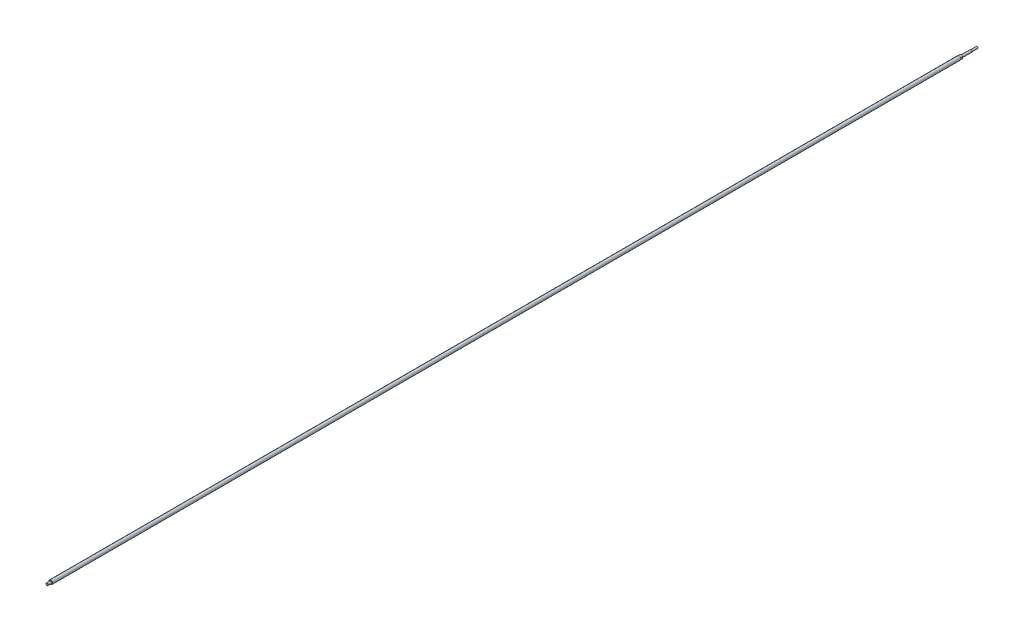
ISO-10303-21;
HEADER;
FILE_DESCRIPTION(('STEP AP214'),'2;1');
FILE_NAME('part.step','',(''),(''),'','','');
FILE_SCHEMA(('AUTOMOTIVE_DESIGN { 1 0 10303 214 1 1 1 1 }'));
ENDSEC;
DATA;
#1=APPLICATION_CONTEXT('core data for automotive mechanical design processes');
#2=APPLICATION_PROTOCOL_DEFINITION('international standard','automotive_design',2000,#1);
#3=PRODUCT_CONTEXT('',#1,'mechanical');
#4=PRODUCT('Part','Part','',(#3));
#5=PRODUCT_RELATED_PRODUCT_CATEGORY('part','',(#4));
#6=PRODUCT_DEFINITION_FORMATION('','',#4);
#7=PRODUCT_DEFINITION_CONTEXT('part definition',#1,'design');
#8=PRODUCT_DEFINITION('design','',#6,#7);
#9=PRODUCT_DEFINITION_SHAPE('','',#8);
#10=(LENGTH_UNIT() NAMED_UNIT(*) SI_UNIT(.MILLI.,.METRE.));
#11=(NAMED_UNIT(*) PLANE_ANGLE_UNIT() SI_UNIT($,.RADIAN.));
#12=(NAMED_UNIT(*) SI_UNIT($,.STERADIAN.) SOLID_ANGLE_UNIT());
#13=UNCERTAINTY_MEASURE_WITH_UNIT(LENGTH_MEASURE(1.E-05),#10,'distance_accuracy_value','');
#14=(GEOMETRIC_REPRESENTATION_CONTEXT(3) GLOBAL_UNCERTAINTY_ASSIGNED_CONTEXT((#13)) GLOBAL_UNIT_ASSIGNED_CONTEXT((#10,
#11,#12)) REPRESENTATION_CONTEXT('',''));
#15=CARTESIAN_POINT('',(0.,0.,0.));
#16=DIRECTION('',(0.,0.,1.));
#17=DIRECTION('',(1.,0.,0.));
#18=AXIS2_PLACEMENT_3D('',#15,#16,#17);
#19=CARTESIAN_POINT('',(0.,0.,2500.));
#20=DIRECTION('',(0.,0.,-1.));
#21=DIRECTION('',(-1.,0.,0.));
#22=AXIS2_PLACEMENT_3D('',#19,#20,#21);
#23=CYLINDRICAL_SURFACE('',#22,5.);
#24=CARTESIAN_POINT('',(0.,0.,49.5));
#25=DIRECTION('',(0.,0.,-1.));
#26=DIRECTION('',(-1.,0.,0.));
#27=AXIS2_PLACEMENT_3D('',#24,#25,#26);
#28=CIRCLE('',#27,5.);
#29=CARTESIAN_POINT('',(-5.,0.,49.5));
#30=VERTEX_POINT('',#29);
#31=EDGE_CURVE('E11',#30,#30,#28,.T.);
#32=ORIENTED_EDGE('',*,*,#31,.F.);
#33=EDGE_LOOP('',(#32));
#34=FACE_BOUND('',#33,.T.);
#35=CARTESIAN_POINT('',(0.,0.,2490.));
#36=DIRECTION('',(0.,0.,1.));
#37=DIRECTION('',(1.,0.,0.));
#38=AXIS2_PLACEMENT_3D('',#35,#36,#37);
#39=CIRCLE('',#38,5.);
#40=CARTESIAN_POINT('',(5.,0.,2490.));
#41=VERTEX_POINT('',#40);
#42=EDGE_CURVE('E134',#41,#41,#39,.T.);
#43=ORIENTED_EDGE('',*,*,#42,.F.);
#44=EDGE_LOOP('',(#43));
#45=FACE_BOUND('',#44,.T.);
#46=ADVANCED_FACE('F39',(#34,#45),#23,.T.);
#47=CARTESIAN_POINT('',(0.,0.,43.));
#48=DIRECTION('',(0.,0.,-1.));
#49=DIRECTION('',(-1.,0.,0.));
#50=AXIS2_PLACEMENT_3D('',#47,#48,#49);
#51=CYLINDRICAL_SURFACE('',#50,3.);
#52=CARTESIAN_POINT('',(0.,0.,43.));
#53=DIRECTION('',(0.,0.,-1.));
#54=DIRECTION('',(-1.,0.,0.));
#55=AXIS2_PLACEMENT_3D('',#52,#53,#54);
#56=CIRCLE('',#55,3.);
#57=CARTESIAN_POINT('',(-3.,0.,43.));
#58=VERTEX_POINT('',#57);
#59=EDGE_CURVE('E108',#58,#58,#56,.T.);
#60=ORIENTED_EDGE('',*,*,#59,.T.);
#61=EDGE_LOOP('',(#60));
#62=FACE_BOUND('',#61,.T.);
#63=CARTESIAN_POINT('',(0.,0.,16.));
#64=DIRECTION('',(0.,0.,-1.));
#65=DIRECTION('',(-1.,0.,0.));
#66=AXIS2_PLACEMENT_3D('',#63,#64,#65);
#67=CIRCLE('',#66,3.);
#68=CARTESIAN_POINT('',(-3.,0.,16.));
#69=VERTEX_POINT('',#68);
#70=EDGE_CURVE('E124',#69,#69,#67,.T.);
#71=ORIENTED_EDGE('',*,*,#70,.F.);
#72=EDGE_LOOP('',(#71));
#73=FACE_BOUND('',#72,.T.);
#74=ADVANCED_FACE('F164',(#62,#73),#51,.T.);
#75=CARTESIAN_POINT('',(0.,0.,49.5));
#76=DIRECTION('',(0.,0.,-1.));
#77=DIRECTION('',(-1.,0.,0.));
#78=AXIS2_PLACEMENT_3D('',#75,#76,#77);
#79=CYLINDRICAL_SURFACE('',#78,4.75);
#80=DIRECTION('',(0.,0.,-1.));
#81=VECTOR('',#80,1.);
#82=CARTESIAN_POINT('',(4.,2.5617376914899,54.678078794302));
#83=LINE('',#82,#81);
#84=CARTESIAN_POINT('',(4.,2.5617376914899,49.5));
#85=VERTEX_POINT('',#84);
#86=CARTESIAN_POINT('',(4.,2.5617376914899,43.));
#87=VERTEX_POINT('',#86);
#88=EDGE_CURVE('E80',#85,#87,#83,.T.);
#89=ORIENTED_EDGE('',*,*,#88,.T.);
#90=CARTESIAN_POINT('',(0.,0.,43.));
#91=DIRECTION('',(0.,0.,-1.));
#92=DIRECTION('',(-1.,0.,0.));
#93=AXIS2_PLACEMENT_3D('',#90,#91,#92);
#94=CIRCLE('',#93,4.75);
#95=CARTESIAN_POINT('',(-4.,2.5617376914899,43.));
#96=VERTEX_POINT('',#95);
#97=EDGE_CURVE('E93',#96,#87,#94,.T.);
#98=ORIENTED_EDGE('',*,*,#97,.F.);
#99=DIRECTION('',(0.,0.,-1.));
#100=VECTOR('',#99,1.);
#101=CARTESIAN_POINT('',(-4.,2.5617376914899,54.678078794302));
#102=LINE('',#101,#100);
#103=CARTESIAN_POINT('',(-4.,2.5617376914899,49.5));
#104=VERTEX_POINT('',#103);
#105=EDGE_CURVE('E62',#104,#96,#102,.T.);
#106=ORIENTED_EDGE('',*,*,#105,.F.);
#107=CARTESIAN_POINT('',(0.,0.,49.5));
#108=DIRECTION('',(0.,0.,-1.));
#109=DIRECTION('',(-1.,0.,0.));
#110=AXIS2_PLACEMENT_3D('',#107,#108,#109);
#111=CIRCLE('',#110,4.75);
#112=EDGE_CURVE('E47',#104,#85,#111,.T.);
#113=ORIENTED_EDGE('',*,*,#112,.T.);
#114=EDGE_LOOP('',(#89,#98,#106,#113));
#115=FACE_BOUND('',#114,.T.);
#116=ADVANCED_FACE('F92',(#115),#79,.T.);
#117=DIRECTION('',(0.,0.,-1.));
#118=VECTOR('',#117,1.);
#119=CARTESIAN_POINT('',(4.,-2.5617376914899,54.678078794302));
#120=LINE('',#119,#118);
#121=CARTESIAN_POINT('',(4.,-2.5617376914899,49.5));
#122=VERTEX_POINT('',#121);
#123=CARTESIAN_POINT('',(4.,-2.5617376914899,43.));
#124=VERTEX_POINT('',#123);
#125=EDGE_CURVE('E54',#122,#124,#120,.T.);
#126=ORIENTED_EDGE('',*,*,#125,.F.);
#127=CARTESIAN_POINT('',(-4.,-2.5617376914899,49.5));
#128=VERTEX_POINT('',#127);
#129=EDGE_CURVE('E102',#122,#128,#111,.T.);
#130=ORIENTED_EDGE('',*,*,#129,.T.);
#131=DIRECTION('',(0.,0.,-1.));
#132=VECTOR('',#131,1.);
#133=CARTESIAN_POINT('',(-4.,-2.5617376914899,54.678078794302));
#134=LINE('',#133,#132);
#135=CARTESIAN_POINT('',(-4.,-2.5617376914899,43.));
#136=VERTEX_POINT('',#135);
#137=EDGE_CURVE('E116',#128,#136,#134,.T.);
#138=ORIENTED_EDGE('',*,*,#137,.T.);
#139=EDGE_CURVE('E103',#124,#136,#94,.T.);
#140=ORIENTED_EDGE('',*,*,#139,.F.);
#141=EDGE_LOOP('',(#126,#130,#138,#140));
#142=FACE_BOUND('',#141,.T.);
#143=ADVANCED_FACE('F175',(#142),#79,.T.);
#144=CARTESIAN_POINT('',(0.,0.,49.5));
#145=DIRECTION('',(0.,0.,-1.));
#146=DIRECTION('',(-1.,0.,0.));
#147=AXIS2_PLACEMENT_3D('',#144,#145,#146);
#148=PLANE('',#147);
#149=ORIENTED_EDGE('',*,*,#112,.F.);
#150=DIRECTION('',(0.,1.,0.));
#151=VECTOR('',#150,1.);
#152=CARTESIAN_POINT('',(-4.,2.5617376914899,49.5));
#153=LINE('',#152,#151);
#154=EDGE_CURVE('E87',#128,#104,#153,.T.);
#155=ORIENTED_EDGE('',*,*,#154,.F.);
#156=ORIENTED_EDGE('',*,*,#129,.F.);
#157=DIRECTION('',(0.,-1.,0.));
#158=VECTOR('',#157,1.);
#159=CARTESIAN_POINT('',(4.,2.5617376914899,49.5));
#160=LINE('',#159,#158);
#161=EDGE_CURVE('E96',#85,#122,#160,.T.);
#162=ORIENTED_EDGE('',*,*,#161,.F.);
#163=EDGE_LOOP('',(#149,#155,#156,#162));
#164=FACE_BOUND('',#163,.T.);
#165=ORIENTED_EDGE('',*,*,#31,.T.);
#166=EDGE_LOOP('',(#165));
#167=FACE_BOUND('',#166,.T.);
#168=ADVANCED_FACE('F173',(#164,#167),#148,.T.);
#169=CARTESIAN_POINT('',(0.,0.,43.));
#170=DIRECTION('',(0.,0.,-1.));
#171=DIRECTION('',(-1.,0.,0.));
#172=AXIS2_PLACEMENT_3D('',#169,#170,#171);
#173=PLANE('',#172);
#174=DIRECTION('',(0.,1.,0.));
#175=VECTOR('',#174,1.);
#176=CARTESIAN_POINT('',(4.,2.5617376914899,43.));
#177=LINE('',#176,#175);
#178=EDGE_CURVE('E77',#124,#87,#177,.T.);
#179=ORIENTED_EDGE('',*,*,#178,.F.);
#180=ORIENTED_EDGE('',*,*,#139,.T.);
#181=DIRECTION('',(0.,-1.,0.));
#182=VECTOR('',#181,1.);
#183=CARTESIAN_POINT('',(-4.,2.5617376914899,43.));
#184=LINE('',#183,#182);
#185=EDGE_CURVE('E100',#96,#136,#184,.T.);
#186=ORIENTED_EDGE('',*,*,#185,.F.);
#187=ORIENTED_EDGE('',*,*,#97,.T.);
#188=EDGE_LOOP('',(#179,#180,#186,#187));
#189=FACE_BOUND('',#188,.T.);
#190=ORIENTED_EDGE('',*,*,#59,.F.);
#191=EDGE_LOOP('',(#190));
#192=FACE_BOUND('',#191,.T.);
#193=ADVANCED_FACE('F98',(#189,#192),#173,.T.);
#194=CARTESIAN_POINT('',(-4.,2.5617376914899,54.678078794302));
#195=DIRECTION('',(1.,0.,0.));
#196=DIRECTION('',(0.,0.,-1.));
#197=AXIS2_PLACEMENT_3D('',#194,#195,#196);
#198=PLANE('',#197);
#199=ORIENTED_EDGE('',*,*,#154,.T.);
#200=ORIENTED_EDGE('',*,*,#105,.T.);
#201=ORIENTED_EDGE('',*,*,#185,.T.);
#202=ORIENTED_EDGE('',*,*,#137,.F.);
#203=EDGE_LOOP('',(#199,#200,#201,#202));
#204=FACE_BOUND('',#203,.T.);
#205=ADVANCED_FACE('F182',(#204),#198,.F.);
#206=CARTESIAN_POINT('',(4.,2.5617376914899,54.678078794302));
#207=DIRECTION('',(-1.,0.,0.));
#208=DIRECTION('',(0.,0.,1.));
#209=AXIS2_PLACEMENT_3D('',#206,#207,#208);
#210=PLANE('',#209);
#211=ORIENTED_EDGE('',*,*,#161,.T.);
#212=ORIENTED_EDGE('',*,*,#125,.T.);
#213=ORIENTED_EDGE('',*,*,#178,.T.);
#214=ORIENTED_EDGE('',*,*,#88,.F.);
#215=EDGE_LOOP('',(#211,#212,#213,#214));
#216=FACE_BOUND('',#215,.T.);
#217=ADVANCED_FACE('F79',(#216),#210,.F.);
#218=CARTESIAN_POINT('',(0.,0.,16.));
#219=DIRECTION('',(0.,0.,-1.));
#220=DIRECTION('',(-1.,0.,0.));
#221=AXIS2_PLACEMENT_3D('',#218,#219,#220);
#222=CYLINDRICAL_SURFACE('',#221,2.5);
#223=CARTESIAN_POINT('',(0.,0.,16.));
#224=DIRECTION('',(0.,0.,-1.));
#225=DIRECTION('',(-1.,0.,0.));
#226=AXIS2_PLACEMENT_3D('',#223,#224,#225);
#227=CIRCLE('',#226,2.5);
#228=CARTESIAN_POINT('',(-2.5,0.,16.));
#229=VERTEX_POINT('',#228);
#230=EDGE_CURVE('E133',#229,#229,#227,.T.);
#231=ORIENTED_EDGE('',*,*,#230,.T.);
#232=EDGE_LOOP('',(#231));
#233=FACE_BOUND('',#232,.T.);
#234=CARTESIAN_POINT('',(0.,0.,0.));
#235=DIRECTION('',(0.,0.,-1.));
#236=DIRECTION('',(-1.,0.,0.));
#237=AXIS2_PLACEMENT_3D('',#234,#235,#236);
#238=CIRCLE('',#237,2.5);
#239=CARTESIAN_POINT('',(-2.5,0.,0.));
#240=VERTEX_POINT('',#239);
#241=EDGE_CURVE('E129',#240,#240,#238,.T.);
#242=ORIENTED_EDGE('',*,*,#241,.F.);
#243=EDGE_LOOP('',(#242));
#244=FACE_BOUND('',#243,.T.);
#245=ADVANCED_FACE('F198',(#233,#244),#222,.T.);
#246=CARTESIAN_POINT('',(0.,0.,16.));
#247=DIRECTION('',(0.,0.,-1.));
#248=DIRECTION('',(-1.,0.,0.));
#249=AXIS2_PLACEMENT_3D('',#246,#247,#248);
#250=PLANE('',#249);
#251=ORIENTED_EDGE('',*,*,#230,.F.);
#252=EDGE_LOOP('',(#251));
#253=FACE_BOUND('',#252,.T.);
#254=ORIENTED_EDGE('',*,*,#70,.T.);
#255=EDGE_LOOP('',(#254));
#256=FACE_BOUND('',#255,.T.);
#257=ADVANCED_FACE('F191',(#253,#256),#250,.T.);
#258=CARTESIAN_POINT('',(0.,0.,0.));
#259=DIRECTION('',(0.,0.,1.));
#260=DIRECTION('',(1.,0.,0.));
#261=AXIS2_PLACEMENT_3D('',#258,#259,#260);
#262=PLANE('',#261);
#263=ORIENTED_EDGE('',*,*,#241,.T.);
#264=EDGE_LOOP('',(#263));
#265=FACE_BOUND('',#264,.T.);
#266=ADVANCED_FACE('F189',(#265),#262,.F.);
#267=CARTESIAN_POINT('',(0.,0.,2490.));
#268=DIRECTION('',(0.,0.,1.));
#269=DIRECTION('',(1.,0.,0.));
#270=AXIS2_PLACEMENT_3D('',#267,#268,#269);
#271=CYLINDRICAL_SURFACE('',#270,3.);
#272=CARTESIAN_POINT('',(0.,0.,2490.));
#273=DIRECTION('',(0.,0.,1.));
#274=DIRECTION('',(1.,0.,0.));
#275=AXIS2_PLACEMENT_3D('',#272,#273,#274);
#276=CIRCLE('',#275,3.);
#277=CARTESIAN_POINT('',(3.,0.,2490.));
#278=VERTEX_POINT('',#277);
#279=EDGE_CURVE('E145',#278,#278,#276,.T.);
#280=ORIENTED_EDGE('',*,*,#279,.T.);
#281=EDGE_LOOP('',(#280));
#282=FACE_BOUND('',#281,.T.);
#283=CARTESIAN_POINT('',(0.,0.,2500.));
#284=DIRECTION('',(0.,0.,1.));
#285=DIRECTION('',(1.,0.,0.));
#286=AXIS2_PLACEMENT_3D('',#283,#284,#285);
#287=CIRCLE('',#286,3.);
#288=CARTESIAN_POINT('',(3.,0.,2500.));
#289=VERTEX_POINT('',#288);
#290=EDGE_CURVE('E141',#289,#289,#287,.T.);
#291=ORIENTED_EDGE('',*,*,#290,.F.);
#292=EDGE_LOOP('',(#291));
#293=FACE_BOUND('',#292,.T.);
#294=ADVANCED_FACE('F153',(#282,#293),#271,.T.);
#295=CARTESIAN_POINT('',(0.,0.,2490.));
#296=DIRECTION('',(0.,0.,1.));
#297=DIRECTION('',(1.,0.,0.));
#298=AXIS2_PLACEMENT_3D('',#295,#296,#297);
#299=PLANE('',#298);
#300=ORIENTED_EDGE('',*,*,#279,.F.);
#301=EDGE_LOOP('',(#300));
#302=FACE_BOUND('',#301,.T.);
#303=ORIENTED_EDGE('',*,*,#42,.T.);
#304=EDGE_LOOP('',(#303));
#305=FACE_BOUND('',#304,.T.);
#306=ADVANCED_FACE('F156',(#302,#305),#299,.T.);
#307=CARTESIAN_POINT('',(0.,0.,2500.));
#308=DIRECTION('',(0.,0.,1.));
#309=DIRECTION('',(1.,0.,0.));
#310=AXIS2_PLACEMENT_3D('',#307,#308,#309);
#311=PLANE('',#310);
#312=ORIENTED_EDGE('',*,*,#290,.T.);
#313=EDGE_LOOP('',(#312));
#314=FACE_BOUND('',#313,.T.);
#315=ADVANCED_FACE('F159',(#314),#311,.T.);
#316=CLOSED_SHELL('',(#46,#74,#116,#143,#168,#193,#205,#217,#245,#257,#266,#294,#306,#315));
#317=MANIFOLD_SOLID_BREP('B2',#316);
#318=ADVANCED_BREP_SHAPE_REPRESENTATION('',(#18,#317),#14);
#319=SHAPE_DEFINITION_REPRESENTATION(#9,#318);
ENDSEC;
END-ISO-10303-21;
